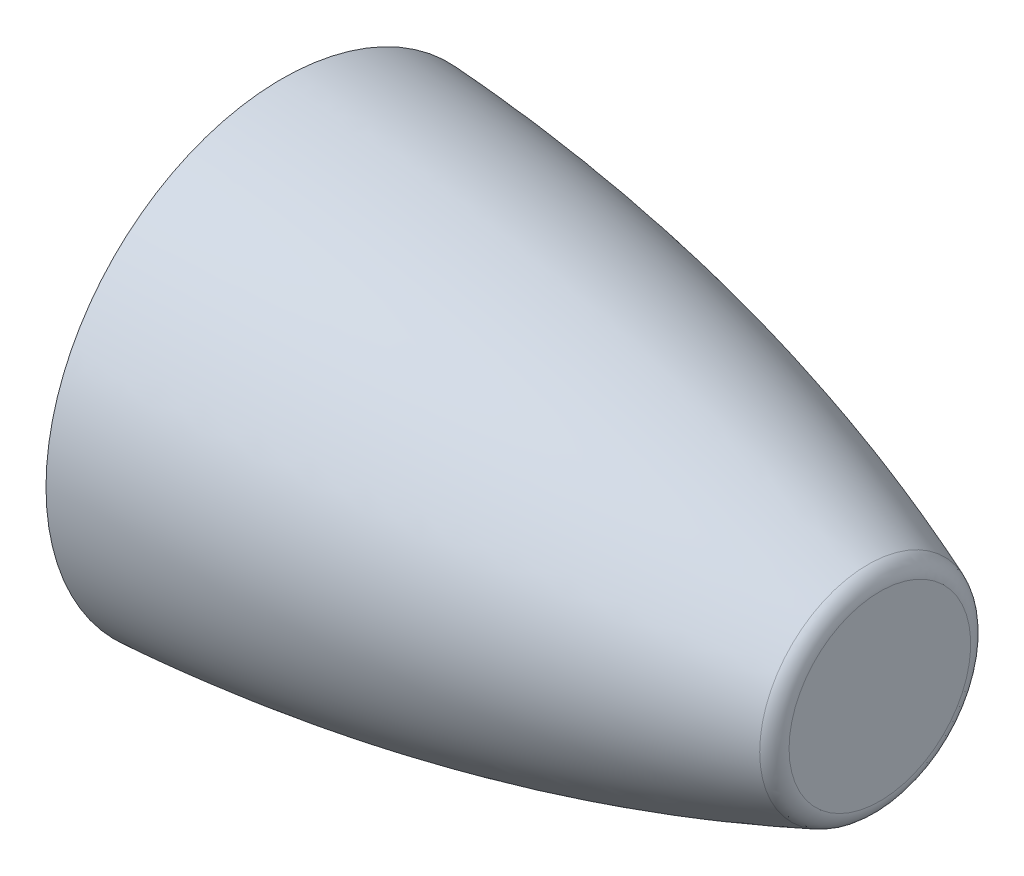
ISO-10303-21;
HEADER;
FILE_DESCRIPTION(('STEP AP214'),'2;1');
FILE_NAME('part.step','',(''),(''),'','','');
FILE_SCHEMA(('AUTOMOTIVE_DESIGN { 1 0 10303 214 1 1 1 1 }'));
ENDSEC;
DATA;
#1=APPLICATION_CONTEXT('core data for automotive mechanical design processes');
#2=APPLICATION_PROTOCOL_DEFINITION('international standard','automotive_design',2000,#1);
#3=PRODUCT_CONTEXT('',#1,'mechanical');
#4=PRODUCT('Part','Part','',(#3));
#5=PRODUCT_RELATED_PRODUCT_CATEGORY('part','',(#4));
#6=PRODUCT_DEFINITION_FORMATION('','',#4);
#7=PRODUCT_DEFINITION_CONTEXT('part definition',#1,'design');
#8=PRODUCT_DEFINITION('design','',#6,#7);
#9=PRODUCT_DEFINITION_SHAPE('','',#8);
#10=(LENGTH_UNIT() NAMED_UNIT(*) SI_UNIT(.MILLI.,.METRE.));
#11=(NAMED_UNIT(*) PLANE_ANGLE_UNIT() SI_UNIT($,.RADIAN.));
#12=(NAMED_UNIT(*) SI_UNIT($,.STERADIAN.) SOLID_ANGLE_UNIT());
#13=UNCERTAINTY_MEASURE_WITH_UNIT(LENGTH_MEASURE(1.E-05),#10,'distance_accuracy_value','');
#14=(GEOMETRIC_REPRESENTATION_CONTEXT(3) GLOBAL_UNCERTAINTY_ASSIGNED_CONTEXT((#13)) GLOBAL_UNIT_ASSIGNED_CONTEXT((#10,
#11,#12)) REPRESENTATION_CONTEXT('',''));
#15=CARTESIAN_POINT('',(0.,0.,0.));
#16=DIRECTION('',(0.,0.,1.));
#17=DIRECTION('',(1.,0.,0.));
#18=AXIS2_PLACEMENT_3D('',#15,#16,#17);
#19=CARTESIAN_POINT('',(15.5600590161681,2.87470828519673,0.));
#20=CARTESIAN_POINT('',(15.7338398685176,2.80547202957039,0.));
#21=CARTESIAN_POINT('',(15.8750000063299,2.59728125216726,0.));
#22=CARTESIAN_POINT('',(15.875,2.41021590600051,0.));
#23=B_SPLINE_CURVE_WITH_KNOTS('',3,(#19,#20,#21,#22),.UNSPECIFIED.,.F.,.F.,(4,4),(0.,1.),.UNSPECIFIED.);
#24=CARTESIAN_POINT('',(15.8800000120388,0.,0.));
#25=DIRECTION('',(-1.,0.,0.));
#26=AXIS1_PLACEMENT('',#24,#25);
#27=SURFACE_OF_REVOLUTION('',#23,#26);
#28=CARTESIAN_POINT('',(15.875,0.,0.));
#29=DIRECTION('',(-1.,0.,0.));
#30=DIRECTION('',(0.,0.,1.));
#31=AXIS2_PLACEMENT_3D('',#28,#29,#30);
#32=CIRCLE('',#31,2.41021590600051);
#33=CARTESIAN_POINT('',(15.875,0.,2.41021590600051));
#34=VERTEX_POINT('',#33);
#35=EDGE_CURVE('E10',#34,#34,#32,.T.);
#36=ORIENTED_EDGE('',*,*,#35,.T.);
#37=EDGE_LOOP('',(#36));
#38=FACE_BOUND('',#37,.T.);
#39=CARTESIAN_POINT('',(15.5600590161681,0.,0.));
#40=DIRECTION('',(-1.,0.,0.));
#41=DIRECTION('',(0.,0.,1.));
#42=AXIS2_PLACEMENT_3D('',#39,#40,#41);
#43=CIRCLE('',#42,2.87470828519673);
#44=CARTESIAN_POINT('',(15.5600590161681,0.,2.87470828519673));
#45=VERTEX_POINT('',#44);
#46=EDGE_CURVE('E51',#45,#45,#43,.T.);
#47=ORIENTED_EDGE('',*,*,#46,.F.);
#48=EDGE_LOOP('',(#47));
#49=FACE_BOUND('',#48,.T.);
#50=ADVANCED_FACE('F31',(#38,#49),#27,.F.);
#51=CARTESIAN_POINT('',(15.875,2.41021590600051,0.));
#52=DIRECTION('',(1.,0.,0.));
#53=DIRECTION('',(0.,0.,-1.));
#54=AXIS2_PLACEMENT_3D('',#51,#52,#53);
#55=PLANE('',#54);
#56=ORIENTED_EDGE('',*,*,#35,.F.);
#57=EDGE_LOOP('',(#56));
#58=FACE_BOUND('',#57,.T.);
#59=ADVANCED_FACE('F78',(#58),#55,.T.);
#60=CARTESIAN_POINT('',(12.7,0.,0.));
#61=DIRECTION('',(-1.,0.,0.));
#62=DIRECTION('',(0.,0.,1.));
#63=AXIS2_PLACEMENT_3D('',#60,#61,#62);
#64=PLANE('',#63);
#65=CARTESIAN_POINT('',(12.7,0.,0.));
#66=DIRECTION('',(-1.,0.,0.));
#67=DIRECTION('',(0.,0.,1.));
#68=AXIS2_PLACEMENT_3D('',#65,#66,#67);
#69=CIRCLE('',#68,1.5875);
#70=CARTESIAN_POINT('',(12.7,0.,1.5875));
#71=VERTEX_POINT('',#70);
#72=EDGE_CURVE('E38',#71,#71,#69,.T.);
#73=ORIENTED_EDGE('',*,*,#72,.T.);
#74=EDGE_LOOP('',(#73));
#75=FACE_BOUND('',#74,.T.);
#76=ADVANCED_FACE('F75',(#75),#64,.T.);
#77=CARTESIAN_POINT('',(15.8800000120388,0.,0.));
#78=DIRECTION('',(-1.,0.,0.));
#79=DIRECTION('',(0.,0.,1.));
#80=AXIS2_PLACEMENT_3D('',#77,#78,#79);
#81=CYLINDRICAL_SURFACE('',#80,1.5875);
#82=CARTESIAN_POINT('',(1.69681005357525E-08,0.,0.));
#83=DIRECTION('',(-1.,0.,0.));
#84=DIRECTION('',(0.,0.,1.));
#85=AXIS2_PLACEMENT_3D('',#82,#83,#84);
#86=CIRCLE('',#85,1.5875);
#87=CARTESIAN_POINT('',(1.69681005357525E-08,0.,1.5875));
#88=VERTEX_POINT('',#87);
#89=EDGE_CURVE('E42',#88,#88,#86,.T.);
#90=ORIENTED_EDGE('',*,*,#89,.T.);
#91=EDGE_LOOP('',(#90));
#92=FACE_BOUND('',#91,.T.);
#93=ORIENTED_EDGE('',*,*,#72,.F.);
#94=EDGE_LOOP('',(#93));
#95=FACE_BOUND('',#94,.T.);
#96=ADVANCED_FACE('F71',(#92,#95),#81,.F.);
#97=CARTESIAN_POINT('',(1.69681005357525E-08,1.5875,0.));
#98=DIRECTION('',(-1.,0.,0.));
#99=DIRECTION('',(0.,0.,1.));
#100=AXIS2_PLACEMENT_3D('',#97,#98,#99);
#101=PLANE('',#100);
#102=CARTESIAN_POINT('',(1.69681005357525E-08,0.,0.));
#103=DIRECTION('',(-1.,0.,0.));
#104=DIRECTION('',(0.,0.,1.));
#105=AXIS2_PLACEMENT_3D('',#102,#103,#104);
#106=CIRCLE('',#105,6.25645554759673);
#107=CARTESIAN_POINT('',(1.69681005357525E-08,0.,6.25645554759673));
#108=VERTEX_POINT('',#107);
#109=EDGE_CURVE('E46',#108,#108,#106,.T.);
#110=ORIENTED_EDGE('',*,*,#109,.T.);
#111=EDGE_LOOP('',(#110));
#112=FACE_BOUND('',#111,.T.);
#113=ORIENTED_EDGE('',*,*,#89,.F.);
#114=EDGE_LOOP('',(#113));
#115=FACE_BOUND('',#114,.T.);
#116=ADVANCED_FACE('F67',(#112,#115),#101,.T.);
#117=CARTESIAN_POINT('',(1.69681005357525E-08,6.25645554759673,0.));
#118=CARTESIAN_POINT('',(4.60907960557266,5.98439016374633,0.));
#119=CARTESIAN_POINT('',(10.0139032737509,5.08435941806301,0.));
#120=CARTESIAN_POINT('',(15.5600590161681,2.87470828519673,0.));
#121=B_SPLINE_CURVE_WITH_KNOTS('',3,(#117,#118,#119,#120),.UNSPECIFIED.,.F.,.F.,(4,4),(0.,1.),.UNSPECIFIED.);
#122=CARTESIAN_POINT('',(15.8800000120388,0.,0.));
#123=DIRECTION('',(-1.,0.,0.));
#124=AXIS1_PLACEMENT('',#122,#123);
#125=SURFACE_OF_REVOLUTION('',#121,#124);
#126=ORIENTED_EDGE('',*,*,#46,.T.);
#127=EDGE_LOOP('',(#126));
#128=FACE_BOUND('',#127,.T.);
#129=ORIENTED_EDGE('',*,*,#109,.F.);
#130=EDGE_LOOP('',(#129));
#131=FACE_BOUND('',#130,.T.);
#132=ADVANCED_FACE('F64',(#128,#131),#125,.F.);
#133=CLOSED_SHELL('',(#50,#59,#76,#96,#116,#132));
#134=MANIFOLD_SOLID_BREP('B2',#133);
#135=ADVANCED_BREP_SHAPE_REPRESENTATION('',(#18,#134),#14);
#136=SHAPE_DEFINITION_REPRESENTATION(#9,#135);
ENDSEC;
END-ISO-10303-21;
